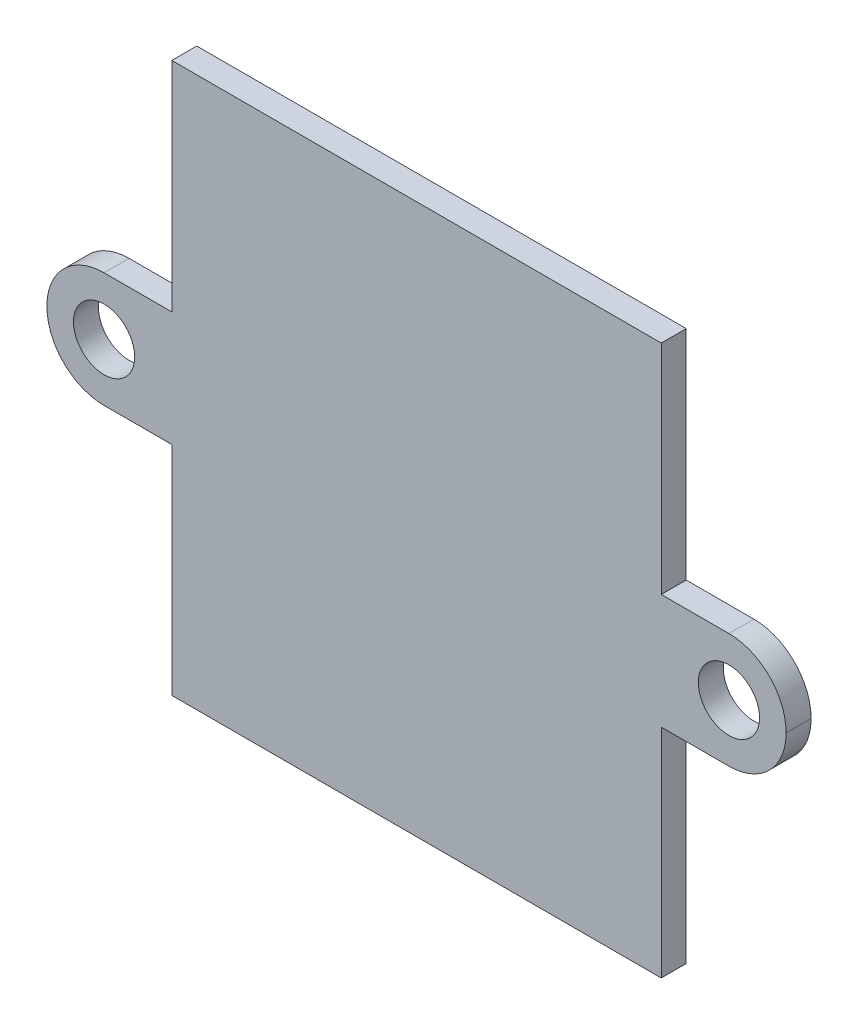
ISO-10303-21;
HEADER;
FILE_DESCRIPTION(('STEP AP214'),'2;1');
FILE_NAME('part.step','',(''),(''),'','','');
FILE_SCHEMA(('AUTOMOTIVE_DESIGN { 1 0 10303 214 1 1 1 1 }'));
ENDSEC;
DATA;
#1=APPLICATION_CONTEXT('core data for automotive mechanical design processes');
#2=APPLICATION_PROTOCOL_DEFINITION('international standard','automotive_design',2000,#1);
#3=PRODUCT_CONTEXT('',#1,'mechanical');
#4=PRODUCT('Part','Part','',(#3));
#5=PRODUCT_RELATED_PRODUCT_CATEGORY('part','',(#4));
#6=PRODUCT_DEFINITION_FORMATION('','',#4);
#7=PRODUCT_DEFINITION_CONTEXT('part definition',#1,'design');
#8=PRODUCT_DEFINITION('design','',#6,#7);
#9=PRODUCT_DEFINITION_SHAPE('','',#8);
#10=(LENGTH_UNIT() NAMED_UNIT(*) SI_UNIT(.MILLI.,.METRE.));
#11=(NAMED_UNIT(*) PLANE_ANGLE_UNIT() SI_UNIT($,.RADIAN.));
#12=(NAMED_UNIT(*) SI_UNIT($,.STERADIAN.) SOLID_ANGLE_UNIT());
#13=UNCERTAINTY_MEASURE_WITH_UNIT(LENGTH_MEASURE(1.E-05),#10,'distance_accuracy_value','');
#14=(GEOMETRIC_REPRESENTATION_CONTEXT(3) GLOBAL_UNCERTAINTY_ASSIGNED_CONTEXT((#13)) GLOBAL_UNIT_ASSIGNED_CONTEXT((#10,
#11,#12)) REPRESENTATION_CONTEXT('',''));
#15=CARTESIAN_POINT('',(0.,0.,0.));
#16=DIRECTION('',(0.,0.,1.));
#17=DIRECTION('',(1.,0.,0.));
#18=AXIS2_PLACEMENT_3D('',#15,#16,#17);
#19=CARTESIAN_POINT('',(-10.2976144578313,-0.636722891566272,1.));
#20=DIRECTION('',(0.,0.,1.));
#21=DIRECTION('',(1.,0.,0.));
#22=AXIS2_PLACEMENT_3D('',#19,#20,#21);
#23=PLANE('',#22);
#24=CARTESIAN_POINT('',(14.7223855421687,-0.656722891566266,1.));
#25=DIRECTION('',(0.,0.,1.));
#26=DIRECTION('',(1.,0.,0.));
#27=AXIS2_PLACEMENT_3D('',#24,#25,#26);
#28=CIRCLE('',#27,1.225);
#29=CARTESIAN_POINT('',(15.9473855421687,-0.656722891566266,1.));
#30=VERTEX_POINT('',#29);
#31=EDGE_CURVE('E181',#30,#30,#28,.T.);
#32=ORIENTED_EDGE('',*,*,#31,.F.);
#33=EDGE_LOOP('',(#32));
#34=FACE_BOUND('',#33,.T.);
#35=DIRECTION('',(0.,-1.,0.));
#36=VECTOR('',#35,1.);
#37=CARTESIAN_POINT('',(-7.58761445783133,10.3732771084337,1.));
#38=LINE('',#37,#36);
#39=CARTESIAN_POINT('',(-7.58761445783133,10.3732771084337,1.));
#40=VERTEX_POINT('',#39);
#41=CARTESIAN_POINT('',(-7.58761445783132,1.65327710843373,1.));
#42=VERTEX_POINT('',#41);
#43=EDGE_CURVE('E208',#40,#42,#38,.T.);
#44=ORIENTED_EDGE('',*,*,#43,.T.);
#45=DIRECTION('',(-1.,0.,0.));
#46=VECTOR('',#45,1.);
#47=CARTESIAN_POINT('',(-7.58761445783132,1.65327710843373,1.));
#48=LINE('',#47,#46);
#49=CARTESIAN_POINT('',(-10.2976144578313,1.65327710843373,1.));
#50=VERTEX_POINT('',#49);
#51=EDGE_CURVE('E116',#42,#50,#48,.T.);
#52=ORIENTED_EDGE('',*,*,#51,.T.);
#53=CARTESIAN_POINT('',(-10.2976144578313,-0.636722891566272,1.));
#54=DIRECTION('',(0.,0.,1.));
#55=DIRECTION('',(1.,0.,0.));
#56=AXIS2_PLACEMENT_3D('',#53,#54,#55);
#57=CIRCLE('',#56,2.29);
#58=CARTESIAN_POINT('',(-12.5876144578313,-0.636722891566289,1.));
#59=VERTEX_POINT('',#58);
#60=EDGE_CURVE('E247',#50,#59,#57,.T.);
#61=ORIENTED_EDGE('',*,*,#60,.T.);
#62=DIRECTION('',(0.,-1.,0.));
#63=VECTOR('',#62,1.);
#64=CARTESIAN_POINT('',(-12.5876144578313,-0.636722891566289,1.));
#65=LINE('',#64,#63);
#66=CARTESIAN_POINT('',(-12.5876144578313,-0.656722891566273,1.));
#67=VERTEX_POINT('',#66);
#68=EDGE_CURVE('E266',#59,#67,#65,.T.);
#69=ORIENTED_EDGE('',*,*,#68,.T.);
#70=CARTESIAN_POINT('',(-10.2976144578313,-0.656722891566273,1.));
#71=DIRECTION('',(0.,0.,1.));
#72=DIRECTION('',(-1.,0.,0.));
#73=AXIS2_PLACEMENT_3D('',#70,#71,#72);
#74=CIRCLE('',#73,2.29);
#75=CARTESIAN_POINT('',(-10.2976144578313,-2.94672289156627,1.));
#76=VERTEX_POINT('',#75);
#77=EDGE_CURVE('E263',#67,#76,#74,.T.);
#78=ORIENTED_EDGE('',*,*,#77,.T.);
#79=DIRECTION('',(1.,0.,0.));
#80=VECTOR('',#79,1.);
#81=CARTESIAN_POINT('',(-10.2976144578313,-2.94672289156627,1.));
#82=LINE('',#81,#80);
#83=CARTESIAN_POINT('',(-7.58761445783132,-2.94672289156627,1.));
#84=VERTEX_POINT('',#83);
#85=EDGE_CURVE('E265',#76,#84,#82,.T.);
#86=ORIENTED_EDGE('',*,*,#85,.T.);
#87=DIRECTION('',(0.,-1.,0.));
#88=VECTOR('',#87,1.);
#89=CARTESIAN_POINT('',(-7.58761445783132,-2.94672289156627,1.));
#90=LINE('',#89,#88);
#91=CARTESIAN_POINT('',(-7.58761445783133,-11.6467228915663,1.));
#92=VERTEX_POINT('',#91);
#93=EDGE_CURVE('E268',#84,#92,#90,.T.);
#94=ORIENTED_EDGE('',*,*,#93,.T.);
#95=DIRECTION('',(1.,0.,0.));
#96=VECTOR('',#95,1.);
#97=CARTESIAN_POINT('',(-7.58761445783133,-11.6467228915663,1.));
#98=LINE('',#97,#96);
#99=CARTESIAN_POINT('',(12.0123855421687,-11.6467228915663,1.));
#100=VERTEX_POINT('',#99);
#101=EDGE_CURVE('E274',#92,#100,#98,.T.);
#102=ORIENTED_EDGE('',*,*,#101,.T.);
#103=DIRECTION('',(0.,1.,0.));
#104=VECTOR('',#103,1.);
#105=CARTESIAN_POINT('',(12.0123855421687,-2.94672289156627,1.));
#106=LINE('',#105,#104);
#107=CARTESIAN_POINT('',(12.0123855421687,-2.94672289156627,1.));
#108=VERTEX_POINT('',#107);
#109=EDGE_CURVE('E276',#100,#108,#106,.T.);
#110=ORIENTED_EDGE('',*,*,#109,.T.);
#111=DIRECTION('',(1.,0.,0.));
#112=VECTOR('',#111,1.);
#113=CARTESIAN_POINT('',(14.7223855421687,-2.94672289156627,1.));
#114=LINE('',#113,#112);
#115=CARTESIAN_POINT('',(14.7223855421687,-2.94672289156627,1.));
#116=VERTEX_POINT('',#115);
#117=EDGE_CURVE('E278',#108,#116,#114,.T.);
#118=ORIENTED_EDGE('',*,*,#117,.T.);
#119=CARTESIAN_POINT('',(14.7223855421687,-0.656722891566266,1.));
#120=DIRECTION('',(0.,0.,1.));
#121=DIRECTION('',(1.,0.,0.));
#122=AXIS2_PLACEMENT_3D('',#119,#120,#121);
#123=CIRCLE('',#122,2.29);
#124=CARTESIAN_POINT('',(17.0123855421687,-0.656722891566249,1.));
#125=VERTEX_POINT('',#124);
#126=EDGE_CURVE('E280',#116,#125,#123,.T.);
#127=ORIENTED_EDGE('',*,*,#126,.T.);
#128=DIRECTION('',(0.,1.,0.));
#129=VECTOR('',#128,1.);
#130=CARTESIAN_POINT('',(17.0123855421687,-0.636722891566282,1.));
#131=LINE('',#130,#129);
#132=CARTESIAN_POINT('',(17.0123855421687,-0.636722891566281,1.));
#133=VERTEX_POINT('',#132);
#134=EDGE_CURVE('E282',#125,#133,#131,.T.);
#135=ORIENTED_EDGE('',*,*,#134,.T.);
#136=CARTESIAN_POINT('',(14.7223855421687,-0.636722891566265,1.));
#137=DIRECTION('',(0.,0.,1.));
#138=DIRECTION('',(-1.,0.,0.));
#139=AXIS2_PLACEMENT_3D('',#136,#137,#138);
#140=CIRCLE('',#139,2.29);
#141=CARTESIAN_POINT('',(14.7223855421687,1.65327710843373,1.));
#142=VERTEX_POINT('',#141);
#143=EDGE_CURVE('E159',#133,#142,#140,.T.);
#144=ORIENTED_EDGE('',*,*,#143,.T.);
#145=DIRECTION('',(-1.,0.,0.));
#146=VECTOR('',#145,1.);
#147=CARTESIAN_POINT('',(12.0123855421687,1.65327710843373,1.));
#148=LINE('',#147,#146);
#149=CARTESIAN_POINT('',(12.0123855421687,1.65327710843373,1.));
#150=VERTEX_POINT('',#149);
#151=EDGE_CURVE('E153',#142,#150,#148,.T.);
#152=ORIENTED_EDGE('',*,*,#151,.T.);
#153=DIRECTION('',(0.,1.,0.));
#154=VECTOR('',#153,1.);
#155=CARTESIAN_POINT('',(12.0123855421687,10.3732771084337,1.));
#156=LINE('',#155,#154);
#157=CARTESIAN_POINT('',(12.0123855421687,10.3732771084337,1.));
#158=VERTEX_POINT('',#157);
#159=EDGE_CURVE('E157',#150,#158,#156,.T.);
#160=ORIENTED_EDGE('',*,*,#159,.T.);
#161=DIRECTION('',(-1.,0.,0.));
#162=VECTOR('',#161,1.);
#163=CARTESIAN_POINT('',(-7.58761445783133,10.3732771084337,1.));
#164=LINE('',#163,#162);
#165=EDGE_CURVE('E49',#158,#40,#164,.T.);
#166=ORIENTED_EDGE('',*,*,#165,.T.);
#167=EDGE_LOOP('',(#44,#52,#61,#69,#78,#86,#94,#102,#110,#118,#127,#135,#144,#152,#160,#166));
#168=FACE_BOUND('',#167,.T.);
#169=CARTESIAN_POINT('',(-10.2976144578313,-0.656722891566273,1.));
#170=DIRECTION('',(0.,0.,1.));
#171=DIRECTION('',(-1.,0.,0.));
#172=AXIS2_PLACEMENT_3D('',#169,#170,#171);
#173=CIRCLE('',#172,1.225);
#174=CARTESIAN_POINT('',(-11.5226144578313,-0.656722891566273,1.));
#175=VERTEX_POINT('',#174);
#176=EDGE_CURVE('E324',#175,#175,#173,.T.);
#177=ORIENTED_EDGE('',*,*,#176,.F.);
#178=EDGE_LOOP('',(#177));
#179=FACE_BOUND('',#178,.T.);
#180=ADVANCED_FACE('F32',(#34,#168,#179),#23,.T.);
#181=CARTESIAN_POINT('',(-10.2976144578313,-0.636722891566272,0.));
#182=DIRECTION('',(0.,0.,1.));
#183=DIRECTION('',(1.,0.,0.));
#184=AXIS2_PLACEMENT_3D('',#181,#182,#183);
#185=PLANE('',#184);
#186=DIRECTION('',(0.,-1.,0.));
#187=VECTOR('',#186,1.);
#188=CARTESIAN_POINT('',(-7.58761445783133,10.3732771084337,0.));
#189=LINE('',#188,#187);
#190=CARTESIAN_POINT('',(-7.58761445783133,10.3732771084337,0.));
#191=VERTEX_POINT('',#190);
#192=CARTESIAN_POINT('',(-7.58761445783132,1.65327710843373,0.));
#193=VERTEX_POINT('',#192);
#194=EDGE_CURVE('E177',#191,#193,#189,.T.);
#195=ORIENTED_EDGE('',*,*,#194,.F.);
#196=DIRECTION('',(-1.,0.,0.));
#197=VECTOR('',#196,1.);
#198=CARTESIAN_POINT('',(-7.58761445783133,10.3732771084337,0.));
#199=LINE('',#198,#197);
#200=CARTESIAN_POINT('',(12.0123855421687,10.3732771084337,0.));
#201=VERTEX_POINT('',#200);
#202=EDGE_CURVE('E108',#201,#191,#199,.T.);
#203=ORIENTED_EDGE('',*,*,#202,.F.);
#204=DIRECTION('',(0.,1.,0.));
#205=VECTOR('',#204,1.);
#206=CARTESIAN_POINT('',(12.0123855421687,10.3732771084337,0.));
#207=LINE('',#206,#205);
#208=CARTESIAN_POINT('',(12.0123855421687,1.65327710843373,0.));
#209=VERTEX_POINT('',#208);
#210=EDGE_CURVE('E102',#209,#201,#207,.T.);
#211=ORIENTED_EDGE('',*,*,#210,.F.);
#212=DIRECTION('',(-1.,0.,0.));
#213=VECTOR('',#212,1.);
#214=CARTESIAN_POINT('',(12.0123855421687,1.65327710843373,0.));
#215=LINE('',#214,#213);
#216=CARTESIAN_POINT('',(14.7223855421687,1.65327710843373,0.));
#217=VERTEX_POINT('',#216);
#218=EDGE_CURVE('E167',#217,#209,#215,.T.);
#219=ORIENTED_EDGE('',*,*,#218,.F.);
#220=CARTESIAN_POINT('',(14.7223855421687,-0.636722891566265,0.));
#221=DIRECTION('',(0.,0.,1.));
#222=DIRECTION('',(-1.,0.,0.));
#223=AXIS2_PLACEMENT_3D('',#220,#221,#222);
#224=CIRCLE('',#223,2.29);
#225=CARTESIAN_POINT('',(17.0123855421687,-0.636722891566281,0.));
#226=VERTEX_POINT('',#225);
#227=EDGE_CURVE('E203',#226,#217,#224,.T.);
#228=ORIENTED_EDGE('',*,*,#227,.F.);
#229=DIRECTION('',(0.,1.,0.));
#230=VECTOR('',#229,1.);
#231=CARTESIAN_POINT('',(17.0123855421687,-0.636722891566282,0.));
#232=LINE('',#231,#230);
#233=CARTESIAN_POINT('',(17.0123855421687,-0.656722891566249,0.));
#234=VERTEX_POINT('',#233);
#235=EDGE_CURVE('E201',#234,#226,#232,.T.);
#236=ORIENTED_EDGE('',*,*,#235,.F.);
#237=CARTESIAN_POINT('',(14.7223855421687,-0.656722891566266,0.));
#238=DIRECTION('',(0.,0.,1.));
#239=DIRECTION('',(1.,0.,0.));
#240=AXIS2_PLACEMENT_3D('',#237,#238,#239);
#241=CIRCLE('',#240,2.29);
#242=CARTESIAN_POINT('',(14.7223855421687,-2.94672289156627,0.));
#243=VERTEX_POINT('',#242);
#244=EDGE_CURVE('E199',#243,#234,#241,.T.);
#245=ORIENTED_EDGE('',*,*,#244,.F.);
#246=DIRECTION('',(1.,0.,0.));
#247=VECTOR('',#246,1.);
#248=CARTESIAN_POINT('',(14.7223855421687,-2.94672289156627,0.));
#249=LINE('',#248,#247);
#250=CARTESIAN_POINT('',(12.0123855421687,-2.94672289156627,0.));
#251=VERTEX_POINT('',#250);
#252=EDGE_CURVE('E197',#251,#243,#249,.T.);
#253=ORIENTED_EDGE('',*,*,#252,.F.);
#254=DIRECTION('',(0.,1.,0.));
#255=VECTOR('',#254,1.);
#256=CARTESIAN_POINT('',(12.0123855421687,-2.94672289156627,0.));
#257=LINE('',#256,#255);
#258=CARTESIAN_POINT('',(12.0123855421687,-11.6467228915663,0.));
#259=VERTEX_POINT('',#258);
#260=EDGE_CURVE('E195',#259,#251,#257,.T.);
#261=ORIENTED_EDGE('',*,*,#260,.F.);
#262=DIRECTION('',(1.,0.,0.));
#263=VECTOR('',#262,1.);
#264=CARTESIAN_POINT('',(-7.58761445783133,-11.6467228915663,0.));
#265=LINE('',#264,#263);
#266=CARTESIAN_POINT('',(-7.58761445783133,-11.6467228915663,0.));
#267=VERTEX_POINT('',#266);
#268=EDGE_CURVE('E193',#267,#259,#265,.T.);
#269=ORIENTED_EDGE('',*,*,#268,.F.);
#270=DIRECTION('',(0.,-1.,0.));
#271=VECTOR('',#270,1.);
#272=CARTESIAN_POINT('',(-7.58761445783132,-2.94672289156627,0.));
#273=LINE('',#272,#271);
#274=CARTESIAN_POINT('',(-7.58761445783132,-2.94672289156627,0.));
#275=VERTEX_POINT('',#274);
#276=EDGE_CURVE('E191',#275,#267,#273,.T.);
#277=ORIENTED_EDGE('',*,*,#276,.F.);
#278=DIRECTION('',(1.,0.,0.));
#279=VECTOR('',#278,1.);
#280=CARTESIAN_POINT('',(-10.2976144578313,-2.94672289156627,0.));
#281=LINE('',#280,#279);
#282=CARTESIAN_POINT('',(-10.2976144578313,-2.94672289156627,0.));
#283=VERTEX_POINT('',#282);
#284=EDGE_CURVE('E189',#283,#275,#281,.T.);
#285=ORIENTED_EDGE('',*,*,#284,.F.);
#286=CARTESIAN_POINT('',(-10.2976144578313,-0.656722891566273,0.));
#287=DIRECTION('',(0.,0.,1.));
#288=DIRECTION('',(-1.,0.,0.));
#289=AXIS2_PLACEMENT_3D('',#286,#287,#288);
#290=CIRCLE('',#289,2.29);
#291=CARTESIAN_POINT('',(-12.5876144578313,-0.656722891566273,0.));
#292=VERTEX_POINT('',#291);
#293=EDGE_CURVE('E187',#292,#283,#290,.T.);
#294=ORIENTED_EDGE('',*,*,#293,.F.);
#295=DIRECTION('',(0.,-1.,0.));
#296=VECTOR('',#295,1.);
#297=CARTESIAN_POINT('',(-12.5876144578313,-0.636722891566289,0.));
#298=LINE('',#297,#296);
#299=CARTESIAN_POINT('',(-12.5876144578313,-0.636722891566289,0.));
#300=VERTEX_POINT('',#299);
#301=EDGE_CURVE('E185',#300,#292,#298,.T.);
#302=ORIENTED_EDGE('',*,*,#301,.F.);
#303=CARTESIAN_POINT('',(-10.2976144578313,-0.636722891566272,0.));
#304=DIRECTION('',(0.,0.,1.));
#305=DIRECTION('',(1.,0.,0.));
#306=AXIS2_PLACEMENT_3D('',#303,#304,#305);
#307=CIRCLE('',#306,2.29);
#308=CARTESIAN_POINT('',(-10.2976144578313,1.65327710843373,0.));
#309=VERTEX_POINT('',#308);
#310=EDGE_CURVE('E183',#309,#300,#307,.T.);
#311=ORIENTED_EDGE('',*,*,#310,.F.);
#312=DIRECTION('',(-1.,0.,0.));
#313=VECTOR('',#312,1.);
#314=CARTESIAN_POINT('',(-7.58761445783132,1.65327710843373,0.));
#315=LINE('',#314,#313);
#316=EDGE_CURVE('E180',#193,#309,#315,.T.);
#317=ORIENTED_EDGE('',*,*,#316,.F.);
#318=EDGE_LOOP('',(#195,#203,#211,#219,#228,#236,#245,#253,#261,#269,#277,#285,#294,#302,#311,#317));
#319=FACE_BOUND('',#318,.T.);
#320=CARTESIAN_POINT('',(14.7223855421687,-0.656722891566266,0.));
#321=DIRECTION('',(0.,0.,1.));
#322=DIRECTION('',(1.,0.,0.));
#323=AXIS2_PLACEMENT_3D('',#320,#321,#322);
#324=CIRCLE('',#323,1.225);
#325=CARTESIAN_POINT('',(15.9473855421687,-0.656722891566266,0.));
#326=VERTEX_POINT('',#325);
#327=EDGE_CURVE('E330',#326,#326,#324,.T.);
#328=ORIENTED_EDGE('',*,*,#327,.T.);
#329=EDGE_LOOP('',(#328));
#330=FACE_BOUND('',#329,.T.);
#331=CARTESIAN_POINT('',(-10.2976144578313,-0.656722891566273,0.));
#332=DIRECTION('',(0.,0.,1.));
#333=DIRECTION('',(-1.,0.,0.));
#334=AXIS2_PLACEMENT_3D('',#331,#332,#333);
#335=CIRCLE('',#334,1.225);
#336=CARTESIAN_POINT('',(-11.5226144578313,-0.656722891566273,0.));
#337=VERTEX_POINT('',#336);
#338=EDGE_CURVE('E327',#337,#337,#335,.T.);
#339=ORIENTED_EDGE('',*,*,#338,.T.);
#340=EDGE_LOOP('',(#339));
#341=FACE_BOUND('',#340,.T.);
#342=ADVANCED_FACE('F251',(#319,#330,#341),#185,.F.);
#343=CARTESIAN_POINT('',(-7.58761445783133,10.3732771084337,1.));
#344=DIRECTION('',(1.,0.,0.));
#345=DIRECTION('',(0.,1.,0.));
#346=AXIS2_PLACEMENT_3D('',#343,#344,#345);
#347=PLANE('',#346);
#348=ORIENTED_EDGE('',*,*,#194,.T.);
#349=DIRECTION('',(0.,0.,-1.));
#350=VECTOR('',#349,1.);
#351=CARTESIAN_POINT('',(-7.58761445783132,1.65327710843373,1.));
#352=LINE('',#351,#350);
#353=EDGE_CURVE('E11',#42,#193,#352,.T.);
#354=ORIENTED_EDGE('',*,*,#353,.F.);
#355=ORIENTED_EDGE('',*,*,#43,.F.);
#356=DIRECTION('',(0.,0.,-1.));
#357=VECTOR('',#356,1.);
#358=CARTESIAN_POINT('',(-7.58761445783133,10.3732771084337,1.));
#359=LINE('',#358,#357);
#360=EDGE_CURVE('E173',#40,#191,#359,.T.);
#361=ORIENTED_EDGE('',*,*,#360,.T.);
#362=EDGE_LOOP('',(#348,#354,#355,#361));
#363=FACE_BOUND('',#362,.T.);
#364=ADVANCED_FACE('F34',(#363),#347,.F.);
#365=CARTESIAN_POINT('',(-7.58761445783132,1.65327710843373,1.));
#366=DIRECTION('',(0.,-1.,0.));
#367=DIRECTION('',(0.,0.,-1.));
#368=AXIS2_PLACEMENT_3D('',#365,#366,#367);
#369=PLANE('',#368);
#370=ORIENTED_EDGE('',*,*,#316,.T.);
#371=DIRECTION('',(0.,0.,-1.));
#372=VECTOR('',#371,1.);
#373=CARTESIAN_POINT('',(-10.2976144578313,1.65327710843373,1.));
#374=LINE('',#373,#372);
#375=EDGE_CURVE('E41',#50,#309,#374,.T.);
#376=ORIENTED_EDGE('',*,*,#375,.F.);
#377=ORIENTED_EDGE('',*,*,#51,.F.);
#378=ORIENTED_EDGE('',*,*,#353,.T.);
#379=EDGE_LOOP('',(#370,#376,#377,#378));
#380=FACE_BOUND('',#379,.T.);
#381=ADVANCED_FACE('F463',(#380),#369,.F.);
#382=CARTESIAN_POINT('',(-10.2976144578313,-0.636722891566272,1.));
#383=DIRECTION('',(0.,0.,-1.));
#384=DIRECTION('',(-1.,0.,0.));
#385=AXIS2_PLACEMENT_3D('',#382,#383,#384);
#386=CYLINDRICAL_SURFACE('',#385,2.29);
#387=ORIENTED_EDGE('',*,*,#310,.T.);
#388=DIRECTION('',(0.,0.,-1.));
#389=VECTOR('',#388,1.);
#390=CARTESIAN_POINT('',(-12.5876144578313,-0.636722891566289,1.));
#391=LINE('',#390,#389);
#392=EDGE_CURVE('E239',#59,#300,#391,.T.);
#393=ORIENTED_EDGE('',*,*,#392,.F.);
#394=ORIENTED_EDGE('',*,*,#60,.F.);
#395=ORIENTED_EDGE('',*,*,#375,.T.);
#396=EDGE_LOOP('',(#387,#393,#394,#395));
#397=FACE_BOUND('',#396,.T.);
#398=ADVANCED_FACE('F245',(#397),#386,.T.);
#399=CARTESIAN_POINT('',(-12.5876144578313,-0.636722891566289,1.));
#400=DIRECTION('',(1.,0.,0.));
#401=DIRECTION('',(0.,0.,-1.));
#402=AXIS2_PLACEMENT_3D('',#399,#400,#401);
#403=PLANE('',#402);
#404=ORIENTED_EDGE('',*,*,#301,.T.);
#405=DIRECTION('',(0.,0.,-1.));
#406=VECTOR('',#405,1.);
#407=CARTESIAN_POINT('',(-12.5876144578313,-0.656722891566273,1.));
#408=LINE('',#407,#406);
#409=EDGE_CURVE('E236',#67,#292,#408,.T.);
#410=ORIENTED_EDGE('',*,*,#409,.F.);
#411=ORIENTED_EDGE('',*,*,#68,.F.);
#412=ORIENTED_EDGE('',*,*,#392,.T.);
#413=EDGE_LOOP('',(#404,#410,#411,#412));
#414=FACE_BOUND('',#413,.T.);
#415=ADVANCED_FACE('F257',(#414),#403,.F.);
#416=CARTESIAN_POINT('',(-10.2976144578313,-0.656722891566273,1.));
#417=DIRECTION('',(0.,0.,-1.));
#418=DIRECTION('',(-1.,0.,0.));
#419=AXIS2_PLACEMENT_3D('',#416,#417,#418);
#420=CYLINDRICAL_SURFACE('',#419,2.29);
#421=ORIENTED_EDGE('',*,*,#293,.T.);
#422=DIRECTION('',(0.,0.,-1.));
#423=VECTOR('',#422,1.);
#424=CARTESIAN_POINT('',(-10.2976144578313,-2.94672289156627,1.));
#425=LINE('',#424,#423);
#426=EDGE_CURVE('E233',#76,#283,#425,.T.);
#427=ORIENTED_EDGE('',*,*,#426,.F.);
#428=ORIENTED_EDGE('',*,*,#77,.F.);
#429=ORIENTED_EDGE('',*,*,#409,.T.);
#430=EDGE_LOOP('',(#421,#427,#428,#429));
#431=FACE_BOUND('',#430,.T.);
#432=ADVANCED_FACE('F261',(#431),#420,.T.);
#433=CARTESIAN_POINT('',(-10.2976144578313,-2.94672289156627,1.));
#434=DIRECTION('',(0.,1.,0.));
#435=DIRECTION('',(0.,0.,1.));
#436=AXIS2_PLACEMENT_3D('',#433,#434,#435);
#437=PLANE('',#436);
#438=ORIENTED_EDGE('',*,*,#284,.T.);
#439=DIRECTION('',(0.,0.,-1.));
#440=VECTOR('',#439,1.);
#441=CARTESIAN_POINT('',(-7.58761445783132,-2.94672289156627,1.));
#442=LINE('',#441,#440);
#443=EDGE_CURVE('E230',#84,#275,#442,.T.);
#444=ORIENTED_EDGE('',*,*,#443,.F.);
#445=ORIENTED_EDGE('',*,*,#85,.F.);
#446=ORIENTED_EDGE('',*,*,#426,.T.);
#447=EDGE_LOOP('',(#438,#444,#445,#446));
#448=FACE_BOUND('',#447,.T.);
#449=ADVANCED_FACE('F428',(#448),#437,.F.);
#450=CARTESIAN_POINT('',(-7.58761445783132,-2.94672289156627,1.));
#451=DIRECTION('',(1.,0.,0.));
#452=DIRECTION('',(0.,1.,0.));
#453=AXIS2_PLACEMENT_3D('',#450,#451,#452);
#454=PLANE('',#453);
#455=ORIENTED_EDGE('',*,*,#276,.T.);
#456=DIRECTION('',(0.,0.,-1.));
#457=VECTOR('',#456,1.);
#458=CARTESIAN_POINT('',(-7.58761445783133,-11.6467228915663,1.));
#459=LINE('',#458,#457);
#460=EDGE_CURVE('E227',#92,#267,#459,.T.);
#461=ORIENTED_EDGE('',*,*,#460,.F.);
#462=ORIENTED_EDGE('',*,*,#93,.F.);
#463=ORIENTED_EDGE('',*,*,#443,.T.);
#464=EDGE_LOOP('',(#455,#461,#462,#463));
#465=FACE_BOUND('',#464,.T.);
#466=ADVANCED_FACE('F418',(#465),#454,.F.);
#467=CARTESIAN_POINT('',(-7.58761445783133,-11.6467228915663,1.));
#468=DIRECTION('',(0.,1.,0.));
#469=DIRECTION('',(0.,0.,1.));
#470=AXIS2_PLACEMENT_3D('',#467,#468,#469);
#471=PLANE('',#470);
#472=ORIENTED_EDGE('',*,*,#268,.T.);
#473=DIRECTION('',(0.,0.,-1.));
#474=VECTOR('',#473,1.);
#475=CARTESIAN_POINT('',(12.0123855421687,-11.6467228915663,1.));
#476=LINE('',#475,#474);
#477=EDGE_CURVE('E224',#100,#259,#476,.T.);
#478=ORIENTED_EDGE('',*,*,#477,.F.);
#479=ORIENTED_EDGE('',*,*,#101,.F.);
#480=ORIENTED_EDGE('',*,*,#460,.T.);
#481=EDGE_LOOP('',(#472,#478,#479,#480));
#482=FACE_BOUND('',#481,.T.);
#483=ADVANCED_FACE('F408',(#482),#471,.F.);
#484=CARTESIAN_POINT('',(12.0123855421687,-2.94672289156627,1.));
#485=DIRECTION('',(-1.,0.,0.));
#486=DIRECTION('',(0.,0.,1.));
#487=AXIS2_PLACEMENT_3D('',#484,#485,#486);
#488=PLANE('',#487);
#489=ORIENTED_EDGE('',*,*,#260,.T.);
#490=DIRECTION('',(0.,0.,-1.));
#491=VECTOR('',#490,1.);
#492=CARTESIAN_POINT('',(12.0123855421687,-2.94672289156627,1.));
#493=LINE('',#492,#491);
#494=EDGE_CURVE('E221',#108,#251,#493,.T.);
#495=ORIENTED_EDGE('',*,*,#494,.F.);
#496=ORIENTED_EDGE('',*,*,#109,.F.);
#497=ORIENTED_EDGE('',*,*,#477,.T.);
#498=EDGE_LOOP('',(#489,#495,#496,#497));
#499=FACE_BOUND('',#498,.T.);
#500=ADVANCED_FACE('F398',(#499),#488,.F.);
#501=CARTESIAN_POINT('',(14.7223855421687,-2.94672289156627,1.));
#502=DIRECTION('',(0.,1.,0.));
#503=DIRECTION('',(0.,0.,1.));
#504=AXIS2_PLACEMENT_3D('',#501,#502,#503);
#505=PLANE('',#504);
#506=ORIENTED_EDGE('',*,*,#252,.T.);
#507=DIRECTION('',(0.,0.,-1.));
#508=VECTOR('',#507,1.);
#509=CARTESIAN_POINT('',(14.7223855421687,-2.94672289156627,1.));
#510=LINE('',#509,#508);
#511=EDGE_CURVE('E218',#116,#243,#510,.T.);
#512=ORIENTED_EDGE('',*,*,#511,.F.);
#513=ORIENTED_EDGE('',*,*,#117,.F.);
#514=ORIENTED_EDGE('',*,*,#494,.T.);
#515=EDGE_LOOP('',(#506,#512,#513,#514));
#516=FACE_BOUND('',#515,.T.);
#517=ADVANCED_FACE('F388',(#516),#505,.F.);
#518=CARTESIAN_POINT('',(14.7223855421687,-0.656722891566266,1.));
#519=DIRECTION('',(0.,0.,-1.));
#520=DIRECTION('',(-1.,0.,0.));
#521=AXIS2_PLACEMENT_3D('',#518,#519,#520);
#522=CYLINDRICAL_SURFACE('',#521,2.29);
#523=ORIENTED_EDGE('',*,*,#244,.T.);
#524=DIRECTION('',(0.,0.,-1.));
#525=VECTOR('',#524,1.);
#526=CARTESIAN_POINT('',(17.0123855421687,-0.656722891566249,1.));
#527=LINE('',#526,#525);
#528=EDGE_CURVE('E215',#125,#234,#527,.T.);
#529=ORIENTED_EDGE('',*,*,#528,.F.);
#530=ORIENTED_EDGE('',*,*,#126,.F.);
#531=ORIENTED_EDGE('',*,*,#511,.T.);
#532=EDGE_LOOP('',(#523,#529,#530,#531));
#533=FACE_BOUND('',#532,.T.);
#534=ADVANCED_FACE('F379',(#533),#522,.T.);
#535=CARTESIAN_POINT('',(17.0123855421687,-0.636722891566282,1.));
#536=DIRECTION('',(-1.,0.,0.));
#537=DIRECTION('',(0.,0.,1.));
#538=AXIS2_PLACEMENT_3D('',#535,#536,#537);
#539=PLANE('',#538);
#540=ORIENTED_EDGE('',*,*,#235,.T.);
#541=DIRECTION('',(0.,0.,-1.));
#542=VECTOR('',#541,1.);
#543=CARTESIAN_POINT('',(17.0123855421687,-0.636722891566281,1.));
#544=LINE('',#543,#542);
#545=EDGE_CURVE('E212',#133,#226,#544,.T.);
#546=ORIENTED_EDGE('',*,*,#545,.F.);
#547=ORIENTED_EDGE('',*,*,#134,.F.);
#548=ORIENTED_EDGE('',*,*,#528,.T.);
#549=EDGE_LOOP('',(#540,#546,#547,#548));
#550=FACE_BOUND('',#549,.T.);
#551=ADVANCED_FACE('F288',(#550),#539,.F.);
#552=CARTESIAN_POINT('',(14.7223855421687,-0.636722891566265,1.));
#553=DIRECTION('',(0.,0.,-1.));
#554=DIRECTION('',(-1.,0.,0.));
#555=AXIS2_PLACEMENT_3D('',#552,#553,#554);
#556=CYLINDRICAL_SURFACE('',#555,2.29);
#557=ORIENTED_EDGE('',*,*,#227,.T.);
#558=DIRECTION('',(0.,0.,-1.));
#559=VECTOR('',#558,1.);
#560=CARTESIAN_POINT('',(14.7223855421687,1.65327710843373,1.));
#561=LINE('',#560,#559);
#562=EDGE_CURVE('E168',#142,#217,#561,.T.);
#563=ORIENTED_EDGE('',*,*,#562,.F.);
#564=ORIENTED_EDGE('',*,*,#143,.F.);
#565=ORIENTED_EDGE('',*,*,#545,.T.);
#566=EDGE_LOOP('',(#557,#563,#564,#565));
#567=FACE_BOUND('',#566,.T.);
#568=ADVANCED_FACE('F292',(#567),#556,.T.);
#569=CARTESIAN_POINT('',(12.0123855421687,1.65327710843373,1.));
#570=DIRECTION('',(0.,-1.,0.));
#571=DIRECTION('',(0.,0.,-1.));
#572=AXIS2_PLACEMENT_3D('',#569,#570,#571);
#573=PLANE('',#572);
#574=ORIENTED_EDGE('',*,*,#218,.T.);
#575=DIRECTION('',(0.,0.,-1.));
#576=VECTOR('',#575,1.);
#577=CARTESIAN_POINT('',(12.0123855421687,1.65327710843373,1.));
#578=LINE('',#577,#576);
#579=EDGE_CURVE('E164',#150,#209,#578,.T.);
#580=ORIENTED_EDGE('',*,*,#579,.F.);
#581=ORIENTED_EDGE('',*,*,#151,.F.);
#582=ORIENTED_EDGE('',*,*,#562,.T.);
#583=EDGE_LOOP('',(#574,#580,#581,#582));
#584=FACE_BOUND('',#583,.T.);
#585=ADVANCED_FACE('F165',(#584),#573,.F.);
#586=CARTESIAN_POINT('',(12.0123855421687,10.3732771084337,1.));
#587=DIRECTION('',(-1.,0.,0.));
#588=DIRECTION('',(0.,0.,1.));
#589=AXIS2_PLACEMENT_3D('',#586,#587,#588);
#590=PLANE('',#589);
#591=ORIENTED_EDGE('',*,*,#210,.T.);
#592=DIRECTION('',(0.,0.,-1.));
#593=VECTOR('',#592,1.);
#594=CARTESIAN_POINT('',(12.0123855421687,10.3732771084337,1.));
#595=LINE('',#594,#593);
#596=EDGE_CURVE('E169',#158,#201,#595,.T.);
#597=ORIENTED_EDGE('',*,*,#596,.F.);
#598=ORIENTED_EDGE('',*,*,#159,.F.);
#599=ORIENTED_EDGE('',*,*,#579,.T.);
#600=EDGE_LOOP('',(#591,#597,#598,#599));
#601=FACE_BOUND('',#600,.T.);
#602=ADVANCED_FACE('F171',(#601),#590,.F.);
#603=CARTESIAN_POINT('',(-7.58761445783133,10.3732771084337,1.));
#604=DIRECTION('',(0.,-1.,0.));
#605=DIRECTION('',(1.,0.,0.));
#606=AXIS2_PLACEMENT_3D('',#603,#604,#605);
#607=PLANE('',#606);
#608=ORIENTED_EDGE('',*,*,#202,.T.);
#609=ORIENTED_EDGE('',*,*,#360,.F.);
#610=ORIENTED_EDGE('',*,*,#165,.F.);
#611=ORIENTED_EDGE('',*,*,#596,.T.);
#612=EDGE_LOOP('',(#608,#609,#610,#611));
#613=FACE_BOUND('',#612,.T.);
#614=ADVANCED_FACE('F296',(#613),#607,.F.);
#615=CARTESIAN_POINT('',(14.7223855421687,-0.656722891566266,1.));
#616=DIRECTION('',(0.,0.,-1.));
#617=DIRECTION('',(-1.,0.,0.));
#618=AXIS2_PLACEMENT_3D('',#615,#616,#617);
#619=CYLINDRICAL_SURFACE('',#618,1.225);
#620=ORIENTED_EDGE('',*,*,#31,.T.);
#621=EDGE_LOOP('',(#620));
#622=FACE_BOUND('',#621,.T.);
#623=ORIENTED_EDGE('',*,*,#327,.F.);
#624=EDGE_LOOP('',(#623));
#625=FACE_BOUND('',#624,.T.);
#626=ADVANCED_FACE('F298',(#622,#625),#619,.F.);
#627=CARTESIAN_POINT('',(-10.2976144578313,-0.656722891566273,1.));
#628=DIRECTION('',(0.,0.,-1.));
#629=DIRECTION('',(-1.,0.,0.));
#630=AXIS2_PLACEMENT_3D('',#627,#628,#629);
#631=CYLINDRICAL_SURFACE('',#630,1.225);
#632=ORIENTED_EDGE('',*,*,#176,.T.);
#633=EDGE_LOOP('',(#632));
#634=FACE_BOUND('',#633,.T.);
#635=ORIENTED_EDGE('',*,*,#338,.F.);
#636=EDGE_LOOP('',(#635));
#637=FACE_BOUND('',#636,.T.);
#638=ADVANCED_FACE('F304',(#634,#637),#631,.F.);
#639=CLOSED_SHELL('',(#180,#342,#364,#381,#398,#415,#432,#449,#466,#483,#500,#517,#534,#551,
#568,#585,#602,#614,#626,#638));
#640=MANIFOLD_SOLID_BREP('B2',#639);
#641=ADVANCED_BREP_SHAPE_REPRESENTATION('',(#18,#640),#14);
#642=SHAPE_DEFINITION_REPRESENTATION(#9,#641);
ENDSEC;
END-ISO-10303-21;
